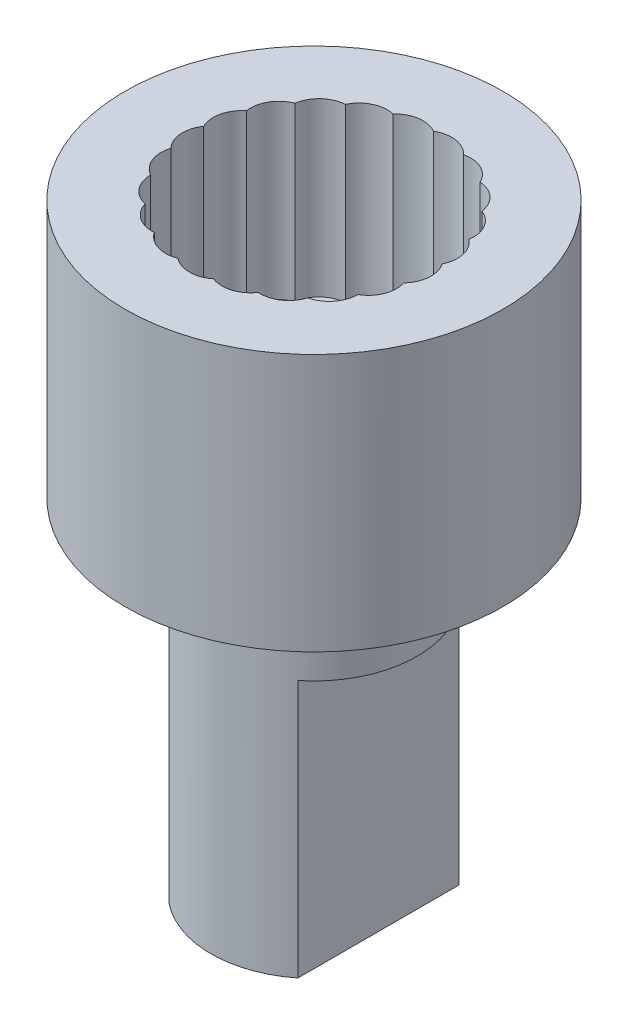
ISO-10303-21;
HEADER;
FILE_DESCRIPTION(('STEP AP214'),'2;1');
FILE_NAME('part.step','',(''),(''),'','','');
FILE_SCHEMA(('AUTOMOTIVE_DESIGN { 1 0 10303 214 1 1 1 1 }'));
ENDSEC;
DATA;
#1=APPLICATION_CONTEXT('core data for automotive mechanical design processes');
#2=APPLICATION_PROTOCOL_DEFINITION('international standard','automotive_design',2000,#1);
#3=PRODUCT_CONTEXT('',#1,'mechanical');
#4=PRODUCT('Part','Part','',(#3));
#5=PRODUCT_RELATED_PRODUCT_CATEGORY('part','',(#4));
#6=PRODUCT_DEFINITION_FORMATION('','',#4);
#7=PRODUCT_DEFINITION_CONTEXT('part definition',#1,'design');
#8=PRODUCT_DEFINITION('design','',#6,#7);
#9=PRODUCT_DEFINITION_SHAPE('','',#8);
#10=(LENGTH_UNIT() NAMED_UNIT(*) SI_UNIT(.MILLI.,.METRE.));
#11=(NAMED_UNIT(*) PLANE_ANGLE_UNIT() SI_UNIT($,.RADIAN.));
#12=(NAMED_UNIT(*) SI_UNIT($,.STERADIAN.) SOLID_ANGLE_UNIT());
#13=UNCERTAINTY_MEASURE_WITH_UNIT(LENGTH_MEASURE(1.E-05),#10,'distance_accuracy_value','');
#14=(GEOMETRIC_REPRESENTATION_CONTEXT(3) GLOBAL_UNCERTAINTY_ASSIGNED_CONTEXT((#13)) GLOBAL_UNIT_ASSIGNED_CONTEXT((#10,
#11,#12)) REPRESENTATION_CONTEXT('',''));
#15=CARTESIAN_POINT('',(0.,0.,0.));
#16=DIRECTION('',(0.,0.,1.));
#17=DIRECTION('',(1.,0.,0.));
#18=AXIS2_PLACEMENT_3D('',#15,#16,#17);
#19=CARTESIAN_POINT('',(0.,-4.,0.));
#20=DIRECTION('',(0.,-1.,0.));
#21=DIRECTION('',(0.,0.,-1.));
#22=AXIS2_PLACEMENT_3D('',#19,#20,#21);
#23=PLANE('',#22);
#24=CARTESIAN_POINT('',(0.,-4.,0.));
#25=DIRECTION('',(0.,-1.,0.));
#26=DIRECTION('',(0.,0.,-1.));
#27=AXIS2_PLACEMENT_3D('',#24,#25,#26);
#28=CIRCLE('',#27,2.4);
#29=CARTESIAN_POINT('',(1.5,-4.,-1.87349939951952));
#30=VERTEX_POINT('',#29);
#31=CARTESIAN_POINT('',(1.5,-4.,1.87349939951952));
#32=VERTEX_POINT('',#31);
#33=EDGE_CURVE('E465',#30,#32,#28,.T.);
#34=ORIENTED_EDGE('',*,*,#33,.T.);
#35=DIRECTION('',(0.,0.,-1.));
#36=VECTOR('',#35,1.);
#37=CARTESIAN_POINT('',(1.5,-4.,0.));
#38=LINE('',#37,#36);
#39=EDGE_CURVE('E430',#32,#30,#38,.T.);
#40=ORIENTED_EDGE('',*,*,#39,.T.);
#41=EDGE_LOOP('',(#34,#40));
#42=FACE_BOUND('',#41,.T.);
#43=ADVANCED_FACE('F41',(#42),#23,.T.);
#44=CARTESIAN_POINT('',(0.,-2.,0.));
#45=DIRECTION('',(0.,1.,0.));
#46=DIRECTION('',(0.,0.,1.));
#47=AXIS2_PLACEMENT_3D('',#44,#45,#46);
#48=CYLINDRICAL_SURFACE('',#47,4.4);
#49=CARTESIAN_POINT('',(0.,-2.,0.));
#50=DIRECTION('',(0.,-1.,0.));
#51=DIRECTION('',(0.,0.,-1.));
#52=AXIS2_PLACEMENT_3D('',#49,#50,#51);
#53=CIRCLE('',#52,4.4);
#54=CARTESIAN_POINT('',(0.,-2.,-4.4));
#55=VERTEX_POINT('',#54);
#56=EDGE_CURVE('E45',#55,#55,#53,.T.);
#57=ORIENTED_EDGE('',*,*,#56,.F.);
#58=EDGE_LOOP('',(#57));
#59=FACE_BOUND('',#58,.T.);
#60=CARTESIAN_POINT('',(0.,4.,0.));
#61=DIRECTION('',(0.,1.,0.));
#62=DIRECTION('',(0.,0.,1.));
#63=AXIS2_PLACEMENT_3D('',#60,#61,#62);
#64=CIRCLE('',#63,4.4);
#65=CARTESIAN_POINT('',(0.,4.,4.4));
#66=VERTEX_POINT('',#65);
#67=EDGE_CURVE('E370',#66,#66,#64,.T.);
#68=ORIENTED_EDGE('',*,*,#67,.F.);
#69=EDGE_LOOP('',(#68));
#70=FACE_BOUND('',#69,.T.);
#71=ADVANCED_FACE('F494',(#59,#70),#48,.T.);
#72=CARTESIAN_POINT('',(0.,-2.,0.));
#73=DIRECTION('',(0.,-1.,0.));
#74=DIRECTION('',(0.,0.,-1.));
#75=AXIS2_PLACEMENT_3D('',#72,#73,#74);
#76=PLANE('',#75);
#77=CARTESIAN_POINT('',(0.,-2.,0.));
#78=DIRECTION('',(0.,-1.,0.));
#79=DIRECTION('',(0.,0.,-1.));
#80=AXIS2_PLACEMENT_3D('',#77,#78,#79);
#81=CIRCLE('',#80,2.4);
#82=CARTESIAN_POINT('',(0.,-2.,-2.4));
#83=VERTEX_POINT('',#82);
#84=EDGE_CURVE('E11',#83,#83,#81,.T.);
#85=ORIENTED_EDGE('',*,*,#84,.F.);
#86=EDGE_LOOP('',(#85));
#87=FACE_BOUND('',#86,.T.);
#88=ORIENTED_EDGE('',*,*,#56,.T.);
#89=EDGE_LOOP('',(#88));
#90=FACE_BOUND('',#89,.T.);
#91=ADVANCED_FACE('F499',(#87,#90),#76,.T.);
#92=CARTESIAN_POINT('',(0.,-4.,0.));
#93=DIRECTION('',(0.,1.,0.));
#94=DIRECTION('',(0.,0.,1.));
#95=AXIS2_PLACEMENT_3D('',#92,#93,#94);
#96=CYLINDRICAL_SURFACE('',#95,2.4);
#97=ORIENTED_EDGE('',*,*,#33,.F.);
#98=DIRECTION('',(0.,1.,0.));
#99=VECTOR('',#98,1.);
#100=CARTESIAN_POINT('',(1.5,-10.,-1.87349939951952));
#101=LINE('',#100,#99);
#102=CARTESIAN_POINT('',(1.5,-10.,-1.87349939951952));
#103=VERTEX_POINT('',#102);
#104=EDGE_CURVE('E448',#103,#30,#101,.T.);
#105=ORIENTED_EDGE('',*,*,#104,.F.);
#106=CARTESIAN_POINT('',(0.,-10.,0.));
#107=DIRECTION('',(0.,-1.,0.));
#108=DIRECTION('',(0.,0.,-1.));
#109=AXIS2_PLACEMENT_3D('',#106,#107,#108);
#110=CIRCLE('',#109,2.4);
#111=CARTESIAN_POINT('',(-1.5,-10.,-1.87349939951952));
#112=VERTEX_POINT('',#111);
#113=EDGE_CURVE('E440',#112,#103,#110,.T.);
#114=ORIENTED_EDGE('',*,*,#113,.F.);
#115=DIRECTION('',(0.,1.,0.));
#116=VECTOR('',#115,1.);
#117=CARTESIAN_POINT('',(-1.5,-10.,-1.87349939951952));
#118=LINE('',#117,#116);
#119=CARTESIAN_POINT('',(-1.5,-4.,-1.87349939951952));
#120=VERTEX_POINT('',#119);
#121=EDGE_CURVE('E452',#112,#120,#118,.T.);
#122=ORIENTED_EDGE('',*,*,#121,.T.);
#123=CARTESIAN_POINT('',(-1.5,-4.,1.87349939951952));
#124=VERTEX_POINT('',#123);
#125=EDGE_CURVE('E464',#124,#120,#28,.T.);
#126=ORIENTED_EDGE('',*,*,#125,.F.);
#127=DIRECTION('',(0.,1.,0.));
#128=VECTOR('',#127,1.);
#129=CARTESIAN_POINT('',(-1.5,-10.,1.87349939951952));
#130=LINE('',#129,#128);
#131=CARTESIAN_POINT('',(-1.5,-10.,1.87349939951952));
#132=VERTEX_POINT('',#131);
#133=EDGE_CURVE('E456',#132,#124,#130,.T.);
#134=ORIENTED_EDGE('',*,*,#133,.F.);
#135=CARTESIAN_POINT('',(1.5,-10.,1.87349939951952));
#136=VERTEX_POINT('',#135);
#137=EDGE_CURVE('E435',#136,#132,#110,.T.);
#138=ORIENTED_EDGE('',*,*,#137,.F.);
#139=DIRECTION('',(0.,1.,0.));
#140=VECTOR('',#139,1.);
#141=CARTESIAN_POINT('',(1.5,-10.,1.87349939951952));
#142=LINE('',#141,#140);
#143=EDGE_CURVE('E460',#136,#32,#142,.T.);
#144=ORIENTED_EDGE('',*,*,#143,.T.);
#145=EDGE_LOOP('',(#97,#105,#114,#122,#126,#134,#138,#144));
#146=FACE_BOUND('',#145,.T.);
#147=ORIENTED_EDGE('',*,*,#84,.T.);
#148=EDGE_LOOP('',(#147));
#149=FACE_BOUND('',#148,.T.);
#150=ADVANCED_FACE('F482',(#146,#149),#96,.T.);
#151=DIRECTION('',(0.,0.,-1.));
#152=VECTOR('',#151,1.);
#153=CARTESIAN_POINT('',(-1.5,-4.,0.));
#154=LINE('',#153,#152);
#155=EDGE_CURVE('E436',#124,#120,#154,.T.);
#156=ORIENTED_EDGE('',*,*,#155,.F.);
#157=ORIENTED_EDGE('',*,*,#125,.T.);
#158=EDGE_LOOP('',(#156,#157));
#159=FACE_BOUND('',#158,.T.);
#160=ADVANCED_FACE('F474',(#159),#23,.T.);
#161=CARTESIAN_POINT('',(1.5,-10.,0.));
#162=DIRECTION('',(1.,0.,0.));
#163=DIRECTION('',(0.,0.,-1.));
#164=AXIS2_PLACEMENT_3D('',#161,#162,#163);
#165=PLANE('',#164);
#166=ORIENTED_EDGE('',*,*,#39,.F.);
#167=ORIENTED_EDGE('',*,*,#143,.F.);
#168=DIRECTION('',(0.,0.,-1.));
#169=VECTOR('',#168,1.);
#170=CARTESIAN_POINT('',(1.5,-10.,0.));
#171=LINE('',#170,#169);
#172=EDGE_CURVE('E431',#136,#103,#171,.T.);
#173=ORIENTED_EDGE('',*,*,#172,.T.);
#174=ORIENTED_EDGE('',*,*,#104,.T.);
#175=EDGE_LOOP('',(#166,#167,#173,#174));
#176=FACE_BOUND('',#175,.T.);
#177=ADVANCED_FACE('F492',(#176),#165,.T.);
#178=CARTESIAN_POINT('',(-1.5,-10.,0.));
#179=DIRECTION('',(1.,0.,0.));
#180=DIRECTION('',(0.,0.,-1.));
#181=AXIS2_PLACEMENT_3D('',#178,#179,#180);
#182=PLANE('',#181);
#183=ORIENTED_EDGE('',*,*,#155,.T.);
#184=ORIENTED_EDGE('',*,*,#121,.F.);
#185=DIRECTION('',(0.,0.,-1.));
#186=VECTOR('',#185,1.);
#187=CARTESIAN_POINT('',(-1.5,-10.,0.));
#188=LINE('',#187,#186);
#189=EDGE_CURVE('E439',#132,#112,#188,.T.);
#190=ORIENTED_EDGE('',*,*,#189,.F.);
#191=ORIENTED_EDGE('',*,*,#133,.T.);
#192=EDGE_LOOP('',(#183,#184,#190,#191));
#193=FACE_BOUND('',#192,.T.);
#194=ADVANCED_FACE('F479',(#193),#182,.F.);
#195=CARTESIAN_POINT('',(0.,-10.,0.));
#196=DIRECTION('',(0.,-1.,0.));
#197=DIRECTION('',(0.,0.,-1.));
#198=AXIS2_PLACEMENT_3D('',#195,#196,#197);
#199=PLANE('',#198);
#200=ORIENTED_EDGE('',*,*,#172,.F.);
#201=ORIENTED_EDGE('',*,*,#137,.T.);
#202=ORIENTED_EDGE('',*,*,#189,.T.);
#203=ORIENTED_EDGE('',*,*,#113,.T.);
#204=EDGE_LOOP('',(#200,#201,#202,#203));
#205=FACE_BOUND('',#204,.T.);
#206=ADVANCED_FACE('F488',(#205),#199,.T.);
#207=CARTESIAN_POINT('',(0.,4.,0.));
#208=DIRECTION('',(0.,1.,0.));
#209=DIRECTION('',(0.,0.,1.));
#210=AXIS2_PLACEMENT_3D('',#207,#208,#209);
#211=PLANE('',#210);
#212=ORIENTED_EDGE('',*,*,#67,.T.);
#213=EDGE_LOOP('',(#212));
#214=FACE_BOUND('',#213,.T.);
#215=CARTESIAN_POINT('',(-0.333293227581628,4.,-2.21125608231973));
#216=DIRECTION('',(0.,1.,0.));
#217=DIRECTION('',(0.,0.,1.));
#218=AXIS2_PLACEMENT_3D('',#215,#216,#217);
#219=CIRCLE('',#218,0.663767043184502);
#220=CARTESIAN_POINT('',(0.,4.,-2.78527900178037));
#221=VERTEX_POINT('',#220);
#222=CARTESIAN_POINT('',(-0.820975397952781,4.,-2.66153687062851));
#223=VERTEX_POINT('',#222);
#224=EDGE_CURVE('E220',#221,#223,#219,.T.);
#225=ORIENTED_EDGE('',*,*,#224,.F.);
#226=CARTESIAN_POINT('',(0.33329322758163,4.,-2.21125608231973));
#227=DIRECTION('',(0.,1.,0.));
#228=DIRECTION('',(0.,0.,1.));
#229=AXIS2_PLACEMENT_3D('',#226,#227,#228);
#230=CIRCLE('',#229,0.663767043184509);
#231=CARTESIAN_POINT('',(0.820975397952807,4.,-2.66153687062849));
#232=VERTEX_POINT('',#231);
#233=EDGE_CURVE('E214',#232,#221,#230,.T.);
#234=ORIENTED_EDGE('',*,*,#233,.F.);
#235=CARTESIAN_POINT('',(0.970265116841022,4.,-2.01477627546813));
#236=DIRECTION('',(0.,1.,0.));
#237=DIRECTION('',(0.,0.,1.));
#238=AXIS2_PLACEMENT_3D('',#235,#236,#237);
#239=CIRCLE('',#238,0.663767043184509);
#240=CARTESIAN_POINT('',(1.56900352900631,4.,-2.30130550855909));
#241=VERTEX_POINT('',#240);
#242=EDGE_CURVE('E360',#241,#232,#239,.T.);
#243=ORIENTED_EDGE('',*,*,#242,.F.);
#244=CARTESIAN_POINT('',(1.52102469253075,4.,-1.63927475484114));
#245=DIRECTION('',(0.,1.,0.));
#246=DIRECTION('',(0.,0.,1.));
#247=AXIS2_PLACEMENT_3D('',#244,#245,#246);
#248=CIRCLE('',#247,0.663767043184509);
#249=CARTESIAN_POINT('',(2.17761881104903,4.,-1.73659305294133));
#250=VERTEX_POINT('',#249);
#251=EDGE_CURVE('E356',#250,#241,#248,.T.);
#252=ORIENTED_EDGE('',*,*,#251,.F.);
#253=CARTESIAN_POINT('',(1.93663454938221,4.,-1.11811647840774));
#254=DIRECTION('',(0.,1.,0.));
#255=DIRECTION('',(0.,0.,1.));
#256=AXIS2_PLACEMENT_3D('',#253,#254,#255);
#257=CIRCLE('',#256,0.663767043184509);
#258=CARTESIAN_POINT('',(2.59274310540728,4.,-1.01757668365665));
#259=VERTEX_POINT('',#258);
#260=EDGE_CURVE('E352',#259,#250,#257,.T.);
#261=ORIENTED_EDGE('',*,*,#260,.F.);
#262=CARTESIAN_POINT('',(2.18016592774031,4.,-0.497608646094468));
#263=DIRECTION('',(0.,1.,0.));
#264=DIRECTION('',(0.,0.,1.));
#265=AXIS2_PLACEMENT_3D('',#262,#263,#264);
#266=CIRCLE('',#265,0.663767043184509);
#267=CARTESIAN_POINT('',(2.77749079678439,4.,-0.208144160467343));
#268=VERTEX_POINT('',#267);
#269=EDGE_CURVE('E348',#268,#259,#266,.T.);
#270=ORIENTED_EDGE('',*,*,#269,.F.);
#271=CARTESIAN_POINT('',(2.2299799959181,4.,0.167113898143874));
#272=DIRECTION('',(0.,1.,0.));
#273=DIRECTION('',(0.,0.,1.));
#274=AXIS2_PLACEMENT_3D('',#271,#272,#273);
#275=CIRCLE('',#274,0.663767043184509);
#276=CARTESIAN_POINT('',(2.71544624204961,4.,0.619782884805087));
#277=VERTEX_POINT('',#276);
#278=EDGE_CURVE('E344',#277,#268,#275,.T.);
#279=ORIENTED_EDGE('',*,*,#278,.F.);
#280=CARTESIAN_POINT('',(2.08165055535255,4.,0.816987639164871));
#281=DIRECTION('',(0.,1.,0.));
#282=DIRECTION('',(0.,0.,1.));
#283=AXIS2_PLACEMENT_3D('',#280,#281,#282);
#284=CIRCLE('',#283,0.663767043184509);
#285=CARTESIAN_POINT('',(2.41212237216916,4.,1.39263950089019));
#286=VERTEX_POINT('',#285);
#287=EDGE_CURVE('E340',#286,#277,#284,.T.);
#288=ORIENTED_EDGE('',*,*,#287,.F.);
#289=CARTESIAN_POINT('',(1.74835732777092,4.,1.39426844315487));
#290=DIRECTION('',(0.,1.,0.));
#291=DIRECTION('',(0.,0.,1.));
#292=AXIS2_PLACEMENT_3D('',#289,#290,#291);
#293=CIRCLE('',#292,0.663767043184509);
#294=CARTESIAN_POINT('',(1.8944708440968,4.,2.04175398582342));
#295=VERTEX_POINT('',#294);
#296=EDGE_CURVE('E336',#295,#286,#293,.T.);
#297=ORIENTED_EDGE('',*,*,#296,.F.);
#298=CARTESIAN_POINT('',(1.25971487907708,4.,1.84766237732427));
#299=DIRECTION('',(0.,1.,0.));
#300=DIRECTION('',(0.,0.,1.));
#301=AXIS2_PLACEMENT_3D('',#298,#299,#300);
#302=CIRCLE('',#301,0.663767043184508);
#303=CARTESIAN_POINT('',(1.20848726777808,4.,2.50944966902645));
#304=VERTEX_POINT('',#303);
#305=EDGE_CURVE('E332',#304,#295,#302,.T.);
#306=ORIENTED_EDGE('',*,*,#305,.F.);
#307=CARTESIAN_POINT('',(0.659141235209555,4.,2.13688340093562));
#308=DIRECTION('',(0.,1.,0.));
#309=DIRECTION('',(0.,0.,1.));
#310=AXIS2_PLACEMENT_3D('',#307,#308,#309);
#311=CIRCLE('',#310,0.663767043184509);
#312=CARTESIAN_POINT('',(0.415124294358251,4.,2.75416973659799));
#313=VERTEX_POINT('',#312);
#314=EDGE_CURVE('E328',#313,#304,#311,.T.);
#315=ORIENTED_EDGE('',*,*,#314,.F.);
#316=CARTESIAN_POINT('',(0.,4.,2.2362329568155));
#317=DIRECTION('',(0.,1.,0.));
#318=DIRECTION('',(0.,0.,1.));
#319=AXIS2_PLACEMENT_3D('',#316,#317,#318);
#320=CIRCLE('',#319,0.663767043184509);
#321=CARTESIAN_POINT('',(-0.415124294358269,4.,2.75416973659799));
#322=VERTEX_POINT('',#321);
#323=EDGE_CURVE('E324',#322,#313,#320,.T.);
#324=ORIENTED_EDGE('',*,*,#323,.F.);
#325=CARTESIAN_POINT('',(-0.659141235209571,4.,2.13688340093562));
#326=DIRECTION('',(0.,1.,0.));
#327=DIRECTION('',(0.,0.,1.));
#328=AXIS2_PLACEMENT_3D('',#325,#326,#327);
#329=CIRCLE('',#328,0.663767043184509);
#330=CARTESIAN_POINT('',(-1.2084872677781,4.,2.50944966902644));
#331=VERTEX_POINT('',#330);
#332=EDGE_CURVE('E320',#331,#322,#329,.T.);
#333=ORIENTED_EDGE('',*,*,#332,.F.);
#334=CARTESIAN_POINT('',(-1.2597148790771,4.,1.84766237732427));
#335=DIRECTION('',(0.,1.,0.));
#336=DIRECTION('',(0.,0.,1.));
#337=AXIS2_PLACEMENT_3D('',#334,#335,#336);
#338=CIRCLE('',#337,0.663767043184509);
#339=CARTESIAN_POINT('',(-1.89447084409682,4.,2.04175398582341));
#340=VERTEX_POINT('',#339);
#341=EDGE_CURVE('E316',#340,#331,#338,.T.);
#342=ORIENTED_EDGE('',*,*,#341,.F.);
#343=CARTESIAN_POINT('',(-1.74835732777093,4.,1.39426844315486));
#344=DIRECTION('',(0.,1.,0.));
#345=DIRECTION('',(0.,0.,1.));
#346=AXIS2_PLACEMENT_3D('',#343,#344,#345);
#347=CIRCLE('',#346,0.663767043184509);
#348=CARTESIAN_POINT('',(-2.41212237216917,4.,1.39263950089018));
#349=VERTEX_POINT('',#348);
#350=EDGE_CURVE('E312',#349,#340,#347,.T.);
#351=ORIENTED_EDGE('',*,*,#350,.F.);
#352=CARTESIAN_POINT('',(-2.08165055535256,4.,0.816987639164863));
#353=DIRECTION('',(0.,1.,0.));
#354=DIRECTION('',(0.,0.,1.));
#355=AXIS2_PLACEMENT_3D('',#352,#353,#354);
#356=CIRCLE('',#355,0.663767043184508);
#357=CARTESIAN_POINT('',(-2.71544624204962,4.,0.619782884805078));
#358=VERTEX_POINT('',#357);
#359=EDGE_CURVE('E308',#358,#349,#356,.T.);
#360=ORIENTED_EDGE('',*,*,#359,.F.);
#361=CARTESIAN_POINT('',(-2.22997999591811,4.,0.167113898143865));
#362=DIRECTION('',(0.,1.,0.));
#363=DIRECTION('',(0.,0.,1.));
#364=AXIS2_PLACEMENT_3D('',#361,#362,#363);
#365=CIRCLE('',#364,0.663767043184509);
#366=CARTESIAN_POINT('',(-2.7774907967844,4.,-0.208144160467354));
#367=VERTEX_POINT('',#366);
#368=EDGE_CURVE('E304',#367,#358,#365,.T.);
#369=ORIENTED_EDGE('',*,*,#368,.F.);
#370=CARTESIAN_POINT('',(-2.18016592774032,4.,-0.497608646094477));
#371=DIRECTION('',(0.,1.,0.));
#372=DIRECTION('',(0.,0.,1.));
#373=AXIS2_PLACEMENT_3D('',#370,#371,#372);
#374=CIRCLE('',#373,0.663767043184509);
#375=CARTESIAN_POINT('',(-2.59274310540728,4.,-1.01757668365666));
#376=VERTEX_POINT('',#375);
#377=EDGE_CURVE('E300',#376,#367,#374,.T.);
#378=ORIENTED_EDGE('',*,*,#377,.F.);
#379=CARTESIAN_POINT('',(-1.93663454938219,4.,-1.11811647840777));
#380=DIRECTION('',(0.,1.,0.));
#381=DIRECTION('',(0.,0.,1.));
#382=AXIS2_PLACEMENT_3D('',#379,#380,#381);
#383=CIRCLE('',#382,0.663767043184519);
#384=CARTESIAN_POINT('',(-2.177618811049,4.,-1.73659305294138));
#385=VERTEX_POINT('',#384);
#386=EDGE_CURVE('E296',#385,#376,#383,.T.);
#387=ORIENTED_EDGE('',*,*,#386,.F.);
#388=CARTESIAN_POINT('',(-1.52102469253073,4.,-1.63927475484116));
#389=DIRECTION('',(0.,1.,0.));
#390=DIRECTION('',(0.,0.,1.));
#391=AXIS2_PLACEMENT_3D('',#388,#389,#390);
#392=CIRCLE('',#391,0.663767043184509);
#393=CARTESIAN_POINT('',(-1.56900352900628,4.,-2.30130550855911));
#394=VERTEX_POINT('',#393);
#395=EDGE_CURVE('E292',#394,#385,#392,.T.);
#396=ORIENTED_EDGE('',*,*,#395,.F.);
#397=CARTESIAN_POINT('',(-0.970265116840991,4.,-2.01477627546815));
#398=DIRECTION('',(0.,1.,0.));
#399=DIRECTION('',(0.,0.,1.));
#400=AXIS2_PLACEMENT_3D('',#397,#398,#399);
#401=CIRCLE('',#400,0.663767043184509);
#402=EDGE_CURVE('E289',#223,#394,#401,.T.);
#403=ORIENTED_EDGE('',*,*,#402,.F.);
#404=EDGE_LOOP('',(#225,#234,#243,#252,#261,#270,#279,#288,#297,#306,#315,#324,#333,#342,#351,
#360,#369,#378,#387,#396,#403));
#405=FACE_BOUND('',#404,.T.);
#406=ADVANCED_FACE('F43',(#214,#405),#211,.T.);
#407=CARTESIAN_POINT('',(-0.333293227581628,0.,-2.21125608231973));
#408=DIRECTION('',(0.,1.,0.));
#409=DIRECTION('',(0.,0.,1.));
#410=AXIS2_PLACEMENT_3D('',#407,#408,#409);
#411=CYLINDRICAL_SURFACE('',#410,0.663767043184502);
#412=ORIENTED_EDGE('',*,*,#224,.T.);
#413=DIRECTION('',(0.,1.,0.));
#414=VECTOR('',#413,1.);
#415=CARTESIAN_POINT('',(-0.820975397952781,0.,-2.66153687062851));
#416=LINE('',#415,#414);
#417=CARTESIAN_POINT('',(-0.820975397952781,0.,-2.66153687062851));
#418=VERTEX_POINT('',#417);
#419=EDGE_CURVE('E217',#418,#223,#416,.T.);
#420=ORIENTED_EDGE('',*,*,#419,.F.);
#421=CARTESIAN_POINT('',(-0.333293227581628,0.,-2.21125608231973));
#422=DIRECTION('',(0.,1.,0.));
#423=DIRECTION('',(0.,0.,1.));
#424=AXIS2_PLACEMENT_3D('',#421,#422,#423);
#425=CIRCLE('',#424,0.663767043184502);
#426=CARTESIAN_POINT('',(0.,0.,-2.78527900178037));
#427=VERTEX_POINT('',#426);
#428=EDGE_CURVE('E206',#427,#418,#425,.T.);
#429=ORIENTED_EDGE('',*,*,#428,.F.);
#430=DIRECTION('',(0.,1.,0.));
#431=VECTOR('',#430,1.);
#432=CARTESIAN_POINT('',(0.,0.,-2.78527900178037));
#433=LINE('',#432,#431);
#434=EDGE_CURVE('E367',#427,#221,#433,.T.);
#435=ORIENTED_EDGE('',*,*,#434,.T.);
#436=EDGE_LOOP('',(#412,#420,#429,#435));
#437=FACE_BOUND('',#436,.T.);
#438=ADVANCED_FACE('F218',(#437),#411,.F.);
#439=CARTESIAN_POINT('',(0.33329322758163,0.,-2.21125608231973));
#440=DIRECTION('',(0.,1.,0.));
#441=DIRECTION('',(0.,0.,1.));
#442=AXIS2_PLACEMENT_3D('',#439,#440,#441);
#443=CYLINDRICAL_SURFACE('',#442,0.663767043184509);
#444=ORIENTED_EDGE('',*,*,#233,.T.);
#445=ORIENTED_EDGE('',*,*,#434,.F.);
#446=CARTESIAN_POINT('',(0.33329322758163,0.,-2.21125608231973));
#447=DIRECTION('',(0.,1.,0.));
#448=DIRECTION('',(0.,0.,1.));
#449=AXIS2_PLACEMENT_3D('',#446,#447,#448);
#450=CIRCLE('',#449,0.663767043184509);
#451=CARTESIAN_POINT('',(0.820975397952807,0.,-2.66153687062849));
#452=VERTEX_POINT('',#451);
#453=EDGE_CURVE('E57',#452,#427,#450,.T.);
#454=ORIENTED_EDGE('',*,*,#453,.F.);
#455=DIRECTION('',(0.,1.,0.));
#456=VECTOR('',#455,1.);
#457=CARTESIAN_POINT('',(0.820975397952807,0.,-2.66153687062849));
#458=LINE('',#457,#456);
#459=EDGE_CURVE('E371',#452,#232,#458,.T.);
#460=ORIENTED_EDGE('',*,*,#459,.T.);
#461=EDGE_LOOP('',(#444,#445,#454,#460));
#462=FACE_BOUND('',#461,.T.);
#463=ADVANCED_FACE('F530',(#462),#443,.F.);
#464=CARTESIAN_POINT('',(0.970265116841022,0.,-2.01477627546813));
#465=DIRECTION('',(0.,1.,0.));
#466=DIRECTION('',(0.,0.,1.));
#467=AXIS2_PLACEMENT_3D('',#464,#465,#466);
#468=CYLINDRICAL_SURFACE('',#467,0.663767043184509);
#469=ORIENTED_EDGE('',*,*,#242,.T.);
#470=ORIENTED_EDGE('',*,*,#459,.F.);
#471=CARTESIAN_POINT('',(0.970265116841022,0.,-2.01477627546813));
#472=DIRECTION('',(0.,1.,0.));
#473=DIRECTION('',(0.,0.,1.));
#474=AXIS2_PLACEMENT_3D('',#471,#472,#473);
#475=CIRCLE('',#474,0.663767043184509);
#476=CARTESIAN_POINT('',(1.56900352900631,0.,-2.30130550855909));
#477=VERTEX_POINT('',#476);
#478=EDGE_CURVE('E62',#477,#452,#475,.T.);
#479=ORIENTED_EDGE('',*,*,#478,.F.);
#480=DIRECTION('',(0.,1.,0.));
#481=VECTOR('',#480,1.);
#482=CARTESIAN_POINT('',(1.56900352900631,0.,-2.30130550855909));
#483=LINE('',#482,#481);
#484=EDGE_CURVE('E374',#477,#241,#483,.T.);
#485=ORIENTED_EDGE('',*,*,#484,.T.);
#486=EDGE_LOOP('',(#469,#470,#479,#485));
#487=FACE_BOUND('',#486,.T.);
#488=ADVANCED_FACE('F566',(#487),#468,.F.);
#489=CARTESIAN_POINT('',(1.52102469253075,0.,-1.63927475484114));
#490=DIRECTION('',(0.,1.,0.));
#491=DIRECTION('',(0.,0.,1.));
#492=AXIS2_PLACEMENT_3D('',#489,#490,#491);
#493=CYLINDRICAL_SURFACE('',#492,0.663767043184509);
#494=ORIENTED_EDGE('',*,*,#251,.T.);
#495=ORIENTED_EDGE('',*,*,#484,.F.);
#496=CARTESIAN_POINT('',(1.52102469253075,0.,-1.63927475484114));
#497=DIRECTION('',(0.,1.,0.));
#498=DIRECTION('',(0.,0.,1.));
#499=AXIS2_PLACEMENT_3D('',#496,#497,#498);
#500=CIRCLE('',#499,0.663767043184509);
#501=CARTESIAN_POINT('',(2.17761881104903,0.,-1.73659305294133));
#502=VERTEX_POINT('',#501);
#503=EDGE_CURVE('E280',#502,#477,#500,.T.);
#504=ORIENTED_EDGE('',*,*,#503,.F.);
#505=DIRECTION('',(0.,1.,0.));
#506=VECTOR('',#505,1.);
#507=CARTESIAN_POINT('',(2.17761881104903,0.,-1.73659305294133));
#508=LINE('',#507,#506);
#509=EDGE_CURVE('E377',#502,#250,#508,.T.);
#510=ORIENTED_EDGE('',*,*,#509,.T.);
#511=EDGE_LOOP('',(#494,#495,#504,#510));
#512=FACE_BOUND('',#511,.T.);
#513=ADVANCED_FACE('F574',(#512),#493,.F.);
#514=CARTESIAN_POINT('',(1.93663454938221,0.,-1.11811647840774));
#515=DIRECTION('',(0.,1.,0.));
#516=DIRECTION('',(0.,0.,1.));
#517=AXIS2_PLACEMENT_3D('',#514,#515,#516);
#518=CYLINDRICAL_SURFACE('',#517,0.663767043184509);
#519=ORIENTED_EDGE('',*,*,#260,.T.);
#520=ORIENTED_EDGE('',*,*,#509,.F.);
#521=CARTESIAN_POINT('',(1.93663454938221,0.,-1.11811647840774));
#522=DIRECTION('',(0.,1.,0.));
#523=DIRECTION('',(0.,0.,1.));
#524=AXIS2_PLACEMENT_3D('',#521,#522,#523);
#525=CIRCLE('',#524,0.663767043184509);
#526=CARTESIAN_POINT('',(2.59274310540728,0.,-1.01757668365665));
#527=VERTEX_POINT('',#526);
#528=EDGE_CURVE('E277',#527,#502,#525,.T.);
#529=ORIENTED_EDGE('',*,*,#528,.F.);
#530=DIRECTION('',(0.,1.,0.));
#531=VECTOR('',#530,1.);
#532=CARTESIAN_POINT('',(2.59274310540728,0.,-1.01757668365665));
#533=LINE('',#532,#531);
#534=EDGE_CURVE('E380',#527,#259,#533,.T.);
#535=ORIENTED_EDGE('',*,*,#534,.T.);
#536=EDGE_LOOP('',(#519,#520,#529,#535));
#537=FACE_BOUND('',#536,.T.);
#538=ADVANCED_FACE('F582',(#537),#518,.F.);
#539=CARTESIAN_POINT('',(2.18016592774031,0.,-0.497608646094468));
#540=DIRECTION('',(0.,1.,0.));
#541=DIRECTION('',(0.,0.,1.));
#542=AXIS2_PLACEMENT_3D('',#539,#540,#541);
#543=CYLINDRICAL_SURFACE('',#542,0.663767043184509);
#544=ORIENTED_EDGE('',*,*,#269,.T.);
#545=ORIENTED_EDGE('',*,*,#534,.F.);
#546=CARTESIAN_POINT('',(2.18016592774031,0.,-0.497608646094468));
#547=DIRECTION('',(0.,1.,0.));
#548=DIRECTION('',(0.,0.,1.));
#549=AXIS2_PLACEMENT_3D('',#546,#547,#548);
#550=CIRCLE('',#549,0.663767043184509);
#551=CARTESIAN_POINT('',(2.77749079678439,0.,-0.208144160467343));
#552=VERTEX_POINT('',#551);
#553=EDGE_CURVE('E274',#552,#527,#550,.T.);
#554=ORIENTED_EDGE('',*,*,#553,.F.);
#555=DIRECTION('',(0.,1.,0.));
#556=VECTOR('',#555,1.);
#557=CARTESIAN_POINT('',(2.77749079678439,0.,-0.208144160467343));
#558=LINE('',#557,#556);
#559=EDGE_CURVE('E383',#552,#268,#558,.T.);
#560=ORIENTED_EDGE('',*,*,#559,.T.);
#561=EDGE_LOOP('',(#544,#545,#554,#560));
#562=FACE_BOUND('',#561,.T.);
#563=ADVANCED_FACE('F590',(#562),#543,.F.);
#564=CARTESIAN_POINT('',(2.2299799959181,0.,0.167113898143874));
#565=DIRECTION('',(0.,1.,0.));
#566=DIRECTION('',(0.,0.,1.));
#567=AXIS2_PLACEMENT_3D('',#564,#565,#566);
#568=CYLINDRICAL_SURFACE('',#567,0.663767043184509);
#569=ORIENTED_EDGE('',*,*,#278,.T.);
#570=ORIENTED_EDGE('',*,*,#559,.F.);
#571=CARTESIAN_POINT('',(2.2299799959181,0.,0.167113898143874));
#572=DIRECTION('',(0.,1.,0.));
#573=DIRECTION('',(0.,0.,1.));
#574=AXIS2_PLACEMENT_3D('',#571,#572,#573);
#575=CIRCLE('',#574,0.663767043184509);
#576=CARTESIAN_POINT('',(2.71544624204961,0.,0.619782884805087));
#577=VERTEX_POINT('',#576);
#578=EDGE_CURVE('E271',#577,#552,#575,.T.);
#579=ORIENTED_EDGE('',*,*,#578,.F.);
#580=DIRECTION('',(0.,1.,0.));
#581=VECTOR('',#580,1.);
#582=CARTESIAN_POINT('',(2.71544624204961,0.,0.619782884805087));
#583=LINE('',#582,#581);
#584=EDGE_CURVE('E386',#577,#277,#583,.T.);
#585=ORIENTED_EDGE('',*,*,#584,.T.);
#586=EDGE_LOOP('',(#569,#570,#579,#585));
#587=FACE_BOUND('',#586,.T.);
#588=ADVANCED_FACE('F598',(#587),#568,.F.);
#589=CARTESIAN_POINT('',(2.08165055535255,0.,0.816987639164871));
#590=DIRECTION('',(0.,1.,0.));
#591=DIRECTION('',(0.,0.,1.));
#592=AXIS2_PLACEMENT_3D('',#589,#590,#591);
#593=CYLINDRICAL_SURFACE('',#592,0.663767043184509);
#594=ORIENTED_EDGE('',*,*,#287,.T.);
#595=ORIENTED_EDGE('',*,*,#584,.F.);
#596=CARTESIAN_POINT('',(2.08165055535255,0.,0.816987639164871));
#597=DIRECTION('',(0.,1.,0.));
#598=DIRECTION('',(0.,0.,1.));
#599=AXIS2_PLACEMENT_3D('',#596,#597,#598);
#600=CIRCLE('',#599,0.663767043184509);
#601=CARTESIAN_POINT('',(2.41212237216916,0.,1.39263950089019));
#602=VERTEX_POINT('',#601);
#603=EDGE_CURVE('E268',#602,#577,#600,.T.);
#604=ORIENTED_EDGE('',*,*,#603,.F.);
#605=DIRECTION('',(0.,1.,0.));
#606=VECTOR('',#605,1.);
#607=CARTESIAN_POINT('',(2.41212237216916,0.,1.39263950089019));
#608=LINE('',#607,#606);
#609=EDGE_CURVE('E389',#602,#286,#608,.T.);
#610=ORIENTED_EDGE('',*,*,#609,.T.);
#611=EDGE_LOOP('',(#594,#595,#604,#610));
#612=FACE_BOUND('',#611,.T.);
#613=ADVANCED_FACE('F606',(#612),#593,.F.);
#614=CARTESIAN_POINT('',(1.74835732777092,0.,1.39426844315487));
#615=DIRECTION('',(0.,1.,0.));
#616=DIRECTION('',(0.,0.,1.));
#617=AXIS2_PLACEMENT_3D('',#614,#615,#616);
#618=CYLINDRICAL_SURFACE('',#617,0.663767043184509);
#619=ORIENTED_EDGE('',*,*,#296,.T.);
#620=ORIENTED_EDGE('',*,*,#609,.F.);
#621=CARTESIAN_POINT('',(1.74835732777092,0.,1.39426844315487));
#622=DIRECTION('',(0.,1.,0.));
#623=DIRECTION('',(0.,0.,1.));
#624=AXIS2_PLACEMENT_3D('',#621,#622,#623);
#625=CIRCLE('',#624,0.663767043184509);
#626=CARTESIAN_POINT('',(1.8944708440968,0.,2.04175398582342));
#627=VERTEX_POINT('',#626);
#628=EDGE_CURVE('E265',#627,#602,#625,.T.);
#629=ORIENTED_EDGE('',*,*,#628,.F.);
#630=DIRECTION('',(0.,1.,0.));
#631=VECTOR('',#630,1.);
#632=CARTESIAN_POINT('',(1.8944708440968,0.,2.04175398582342));
#633=LINE('',#632,#631);
#634=EDGE_CURVE('E392',#627,#295,#633,.T.);
#635=ORIENTED_EDGE('',*,*,#634,.T.);
#636=EDGE_LOOP('',(#619,#620,#629,#635));
#637=FACE_BOUND('',#636,.T.);
#638=ADVANCED_FACE('F614',(#637),#618,.F.);
#639=CARTESIAN_POINT('',(1.25971487907708,0.,1.84766237732427));
#640=DIRECTION('',(0.,1.,0.));
#641=DIRECTION('',(0.,0.,1.));
#642=AXIS2_PLACEMENT_3D('',#639,#640,#641);
#643=CYLINDRICAL_SURFACE('',#642,0.663767043184508);
#644=ORIENTED_EDGE('',*,*,#305,.T.);
#645=ORIENTED_EDGE('',*,*,#634,.F.);
#646=CARTESIAN_POINT('',(1.25971487907708,0.,1.84766237732427));
#647=DIRECTION('',(0.,1.,0.));
#648=DIRECTION('',(0.,0.,1.));
#649=AXIS2_PLACEMENT_3D('',#646,#647,#648);
#650=CIRCLE('',#649,0.663767043184508);
#651=CARTESIAN_POINT('',(1.20848726777808,0.,2.50944966902645));
#652=VERTEX_POINT('',#651);
#653=EDGE_CURVE('E262',#652,#627,#650,.T.);
#654=ORIENTED_EDGE('',*,*,#653,.F.);
#655=DIRECTION('',(0.,1.,0.));
#656=VECTOR('',#655,1.);
#657=CARTESIAN_POINT('',(1.20848726777808,0.,2.50944966902645));
#658=LINE('',#657,#656);
#659=EDGE_CURVE('E395',#652,#304,#658,.T.);
#660=ORIENTED_EDGE('',*,*,#659,.T.);
#661=EDGE_LOOP('',(#644,#645,#654,#660));
#662=FACE_BOUND('',#661,.T.);
#663=ADVANCED_FACE('F622',(#662),#643,.F.);
#664=CARTESIAN_POINT('',(0.659141235209555,0.,2.13688340093562));
#665=DIRECTION('',(0.,1.,0.));
#666=DIRECTION('',(0.,0.,1.));
#667=AXIS2_PLACEMENT_3D('',#664,#665,#666);
#668=CYLINDRICAL_SURFACE('',#667,0.663767043184509);
#669=ORIENTED_EDGE('',*,*,#314,.T.);
#670=ORIENTED_EDGE('',*,*,#659,.F.);
#671=CARTESIAN_POINT('',(0.659141235209555,0.,2.13688340093562));
#672=DIRECTION('',(0.,1.,0.));
#673=DIRECTION('',(0.,0.,1.));
#674=AXIS2_PLACEMENT_3D('',#671,#672,#673);
#675=CIRCLE('',#674,0.663767043184509);
#676=CARTESIAN_POINT('',(0.415124294358251,0.,2.75416973659799));
#677=VERTEX_POINT('',#676);
#678=EDGE_CURVE('E259',#677,#652,#675,.T.);
#679=ORIENTED_EDGE('',*,*,#678,.F.);
#680=DIRECTION('',(0.,1.,0.));
#681=VECTOR('',#680,1.);
#682=CARTESIAN_POINT('',(0.415124294358251,0.,2.75416973659799));
#683=LINE('',#682,#681);
#684=EDGE_CURVE('E398',#677,#313,#683,.T.);
#685=ORIENTED_EDGE('',*,*,#684,.T.);
#686=EDGE_LOOP('',(#669,#670,#679,#685));
#687=FACE_BOUND('',#686,.T.);
#688=ADVANCED_FACE('F630',(#687),#668,.F.);
#689=CARTESIAN_POINT('',(0.,0.,2.2362329568155));
#690=DIRECTION('',(0.,1.,0.));
#691=DIRECTION('',(0.,0.,1.));
#692=AXIS2_PLACEMENT_3D('',#689,#690,#691);
#693=CYLINDRICAL_SURFACE('',#692,0.663767043184509);
#694=ORIENTED_EDGE('',*,*,#323,.T.);
#695=ORIENTED_EDGE('',*,*,#684,.F.);
#696=CARTESIAN_POINT('',(0.,0.,2.2362329568155));
#697=DIRECTION('',(0.,1.,0.));
#698=DIRECTION('',(0.,0.,1.));
#699=AXIS2_PLACEMENT_3D('',#696,#697,#698);
#700=CIRCLE('',#699,0.663767043184509);
#701=CARTESIAN_POINT('',(-0.415124294358269,0.,2.75416973659799));
#702=VERTEX_POINT('',#701);
#703=EDGE_CURVE('E256',#702,#677,#700,.T.);
#704=ORIENTED_EDGE('',*,*,#703,.F.);
#705=DIRECTION('',(0.,1.,0.));
#706=VECTOR('',#705,1.);
#707=CARTESIAN_POINT('',(-0.415124294358269,0.,2.75416973659799));
#708=LINE('',#707,#706);
#709=EDGE_CURVE('E401',#702,#322,#708,.T.);
#710=ORIENTED_EDGE('',*,*,#709,.T.);
#711=EDGE_LOOP('',(#694,#695,#704,#710));
#712=FACE_BOUND('',#711,.T.);
#713=ADVANCED_FACE('F638',(#712),#693,.F.);
#714=CARTESIAN_POINT('',(-0.659141235209571,0.,2.13688340093562));
#715=DIRECTION('',(0.,1.,0.));
#716=DIRECTION('',(0.,0.,1.));
#717=AXIS2_PLACEMENT_3D('',#714,#715,#716);
#718=CYLINDRICAL_SURFACE('',#717,0.663767043184509);
#719=ORIENTED_EDGE('',*,*,#332,.T.);
#720=ORIENTED_EDGE('',*,*,#709,.F.);
#721=CARTESIAN_POINT('',(-0.659141235209571,0.,2.13688340093562));
#722=DIRECTION('',(0.,1.,0.));
#723=DIRECTION('',(0.,0.,1.));
#724=AXIS2_PLACEMENT_3D('',#721,#722,#723);
#725=CIRCLE('',#724,0.663767043184509);
#726=CARTESIAN_POINT('',(-1.2084872677781,0.,2.50944966902644));
#727=VERTEX_POINT('',#726);
#728=EDGE_CURVE('E253',#727,#702,#725,.T.);
#729=ORIENTED_EDGE('',*,*,#728,.F.);
#730=DIRECTION('',(0.,1.,0.));
#731=VECTOR('',#730,1.);
#732=CARTESIAN_POINT('',(-1.2084872677781,0.,2.50944966902644));
#733=LINE('',#732,#731);
#734=EDGE_CURVE('E404',#727,#331,#733,.T.);
#735=ORIENTED_EDGE('',*,*,#734,.T.);
#736=EDGE_LOOP('',(#719,#720,#729,#735));
#737=FACE_BOUND('',#736,.T.);
#738=ADVANCED_FACE('F646',(#737),#718,.F.);
#739=CARTESIAN_POINT('',(-1.2597148790771,0.,1.84766237732427));
#740=DIRECTION('',(0.,1.,0.));
#741=DIRECTION('',(0.,0.,1.));
#742=AXIS2_PLACEMENT_3D('',#739,#740,#741);
#743=CYLINDRICAL_SURFACE('',#742,0.663767043184509);
#744=ORIENTED_EDGE('',*,*,#341,.T.);
#745=ORIENTED_EDGE('',*,*,#734,.F.);
#746=CARTESIAN_POINT('',(-1.2597148790771,0.,1.84766237732427));
#747=DIRECTION('',(0.,1.,0.));
#748=DIRECTION('',(0.,0.,1.));
#749=AXIS2_PLACEMENT_3D('',#746,#747,#748);
#750=CIRCLE('',#749,0.663767043184509);
#751=CARTESIAN_POINT('',(-1.89447084409682,0.,2.04175398582341));
#752=VERTEX_POINT('',#751);
#753=EDGE_CURVE('E250',#752,#727,#750,.T.);
#754=ORIENTED_EDGE('',*,*,#753,.F.);
#755=DIRECTION('',(0.,1.,0.));
#756=VECTOR('',#755,1.);
#757=CARTESIAN_POINT('',(-1.89447084409682,0.,2.04175398582341));
#758=LINE('',#757,#756);
#759=EDGE_CURVE('E407',#752,#340,#758,.T.);
#760=ORIENTED_EDGE('',*,*,#759,.T.);
#761=EDGE_LOOP('',(#744,#745,#754,#760));
#762=FACE_BOUND('',#761,.T.);
#763=ADVANCED_FACE('F654',(#762),#743,.F.);
#764=CARTESIAN_POINT('',(-1.74835732777093,0.,1.39426844315486));
#765=DIRECTION('',(0.,1.,0.));
#766=DIRECTION('',(0.,0.,1.));
#767=AXIS2_PLACEMENT_3D('',#764,#765,#766);
#768=CYLINDRICAL_SURFACE('',#767,0.663767043184509);
#769=ORIENTED_EDGE('',*,*,#350,.T.);
#770=ORIENTED_EDGE('',*,*,#759,.F.);
#771=CARTESIAN_POINT('',(-1.74835732777093,0.,1.39426844315486));
#772=DIRECTION('',(0.,1.,0.));
#773=DIRECTION('',(0.,0.,1.));
#774=AXIS2_PLACEMENT_3D('',#771,#772,#773);
#775=CIRCLE('',#774,0.663767043184509);
#776=CARTESIAN_POINT('',(-2.41212237216917,0.,1.39263950089018));
#777=VERTEX_POINT('',#776);
#778=EDGE_CURVE('E247',#777,#752,#775,.T.);
#779=ORIENTED_EDGE('',*,*,#778,.F.);
#780=DIRECTION('',(0.,1.,0.));
#781=VECTOR('',#780,1.);
#782=CARTESIAN_POINT('',(-2.41212237216917,0.,1.39263950089018));
#783=LINE('',#782,#781);
#784=EDGE_CURVE('E410',#777,#349,#783,.T.);
#785=ORIENTED_EDGE('',*,*,#784,.T.);
#786=EDGE_LOOP('',(#769,#770,#779,#785));
#787=FACE_BOUND('',#786,.T.);
#788=ADVANCED_FACE('F662',(#787),#768,.F.);
#789=CARTESIAN_POINT('',(-2.08165055535256,0.,0.816987639164863));
#790=DIRECTION('',(0.,1.,0.));
#791=DIRECTION('',(0.,0.,1.));
#792=AXIS2_PLACEMENT_3D('',#789,#790,#791);
#793=CYLINDRICAL_SURFACE('',#792,0.663767043184508);
#794=ORIENTED_EDGE('',*,*,#359,.T.);
#795=ORIENTED_EDGE('',*,*,#784,.F.);
#796=CARTESIAN_POINT('',(-2.08165055535256,0.,0.816987639164863));
#797=DIRECTION('',(0.,1.,0.));
#798=DIRECTION('',(0.,0.,1.));
#799=AXIS2_PLACEMENT_3D('',#796,#797,#798);
#800=CIRCLE('',#799,0.663767043184508);
#801=CARTESIAN_POINT('',(-2.71544624204962,0.,0.619782884805078));
#802=VERTEX_POINT('',#801);
#803=EDGE_CURVE('E244',#802,#777,#800,.T.);
#804=ORIENTED_EDGE('',*,*,#803,.F.);
#805=DIRECTION('',(0.,1.,0.));
#806=VECTOR('',#805,1.);
#807=CARTESIAN_POINT('',(-2.71544624204962,0.,0.619782884805078));
#808=LINE('',#807,#806);
#809=EDGE_CURVE('E413',#802,#358,#808,.T.);
#810=ORIENTED_EDGE('',*,*,#809,.T.);
#811=EDGE_LOOP('',(#794,#795,#804,#810));
#812=FACE_BOUND('',#811,.T.);
#813=ADVANCED_FACE('F670',(#812),#793,.F.);
#814=CARTESIAN_POINT('',(-2.22997999591811,0.,0.167113898143865));
#815=DIRECTION('',(0.,1.,0.));
#816=DIRECTION('',(0.,0.,1.));
#817=AXIS2_PLACEMENT_3D('',#814,#815,#816);
#818=CYLINDRICAL_SURFACE('',#817,0.663767043184509);
#819=ORIENTED_EDGE('',*,*,#368,.T.);
#820=ORIENTED_EDGE('',*,*,#809,.F.);
#821=CARTESIAN_POINT('',(-2.22997999591811,0.,0.167113898143865));
#822=DIRECTION('',(0.,1.,0.));
#823=DIRECTION('',(0.,0.,1.));
#824=AXIS2_PLACEMENT_3D('',#821,#822,#823);
#825=CIRCLE('',#824,0.663767043184509);
#826=CARTESIAN_POINT('',(-2.7774907967844,0.,-0.208144160467354));
#827=VERTEX_POINT('',#826);
#828=EDGE_CURVE('E241',#827,#802,#825,.T.);
#829=ORIENTED_EDGE('',*,*,#828,.F.);
#830=DIRECTION('',(0.,1.,0.));
#831=VECTOR('',#830,1.);
#832=CARTESIAN_POINT('',(-2.7774907967844,0.,-0.208144160467354));
#833=LINE('',#832,#831);
#834=EDGE_CURVE('E416',#827,#367,#833,.T.);
#835=ORIENTED_EDGE('',*,*,#834,.T.);
#836=EDGE_LOOP('',(#819,#820,#829,#835));
#837=FACE_BOUND('',#836,.T.);
#838=ADVANCED_FACE('F678',(#837),#818,.F.);
#839=CARTESIAN_POINT('',(-2.18016592774032,0.,-0.497608646094477));
#840=DIRECTION('',(0.,1.,0.));
#841=DIRECTION('',(0.,0.,1.));
#842=AXIS2_PLACEMENT_3D('',#839,#840,#841);
#843=CYLINDRICAL_SURFACE('',#842,0.663767043184509);
#844=ORIENTED_EDGE('',*,*,#377,.T.);
#845=ORIENTED_EDGE('',*,*,#834,.F.);
#846=CARTESIAN_POINT('',(-2.18016592774032,0.,-0.497608646094477));
#847=DIRECTION('',(0.,1.,0.));
#848=DIRECTION('',(0.,0.,1.));
#849=AXIS2_PLACEMENT_3D('',#846,#847,#848);
#850=CIRCLE('',#849,0.663767043184509);
#851=CARTESIAN_POINT('',(-2.59274310540728,0.,-1.01757668365666));
#852=VERTEX_POINT('',#851);
#853=EDGE_CURVE('E238',#852,#827,#850,.T.);
#854=ORIENTED_EDGE('',*,*,#853,.F.);
#855=DIRECTION('',(0.,1.,0.));
#856=VECTOR('',#855,1.);
#857=CARTESIAN_POINT('',(-2.59274310540728,0.,-1.01757668365666));
#858=LINE('',#857,#856);
#859=EDGE_CURVE('E419',#852,#376,#858,.T.);
#860=ORIENTED_EDGE('',*,*,#859,.T.);
#861=EDGE_LOOP('',(#844,#845,#854,#860));
#862=FACE_BOUND('',#861,.T.);
#863=ADVANCED_FACE('F686',(#862),#843,.F.);
#864=CARTESIAN_POINT('',(-1.93663454938219,0.,-1.11811647840777));
#865=DIRECTION('',(0.,1.,0.));
#866=DIRECTION('',(0.,0.,1.));
#867=AXIS2_PLACEMENT_3D('',#864,#865,#866);
#868=CYLINDRICAL_SURFACE('',#867,0.663767043184519);
#869=ORIENTED_EDGE('',*,*,#386,.T.);
#870=ORIENTED_EDGE('',*,*,#859,.F.);
#871=CARTESIAN_POINT('',(-1.93663454938219,0.,-1.11811647840777));
#872=DIRECTION('',(0.,1.,0.));
#873=DIRECTION('',(0.,0.,1.));
#874=AXIS2_PLACEMENT_3D('',#871,#872,#873);
#875=CIRCLE('',#874,0.663767043184519);
#876=CARTESIAN_POINT('',(-2.177618811049,0.,-1.73659305294138));
#877=VERTEX_POINT('',#876);
#878=EDGE_CURVE('E233',#877,#852,#875,.T.);
#879=ORIENTED_EDGE('',*,*,#878,.F.);
#880=DIRECTION('',(0.,1.,0.));
#881=VECTOR('',#880,1.);
#882=CARTESIAN_POINT('',(-2.177618811049,0.,-1.73659305294138));
#883=LINE('',#882,#881);
#884=EDGE_CURVE('E422',#877,#385,#883,.T.);
#885=ORIENTED_EDGE('',*,*,#884,.T.);
#886=EDGE_LOOP('',(#869,#870,#879,#885));
#887=FACE_BOUND('',#886,.T.);
#888=ADVANCED_FACE('F523',(#887),#868,.F.);
#889=CARTESIAN_POINT('',(-1.52102469253073,0.,-1.63927475484116));
#890=DIRECTION('',(0.,1.,0.));
#891=DIRECTION('',(0.,0.,1.));
#892=AXIS2_PLACEMENT_3D('',#889,#890,#891);
#893=CYLINDRICAL_SURFACE('',#892,0.663767043184509);
#894=ORIENTED_EDGE('',*,*,#395,.T.);
#895=ORIENTED_EDGE('',*,*,#884,.F.);
#896=CARTESIAN_POINT('',(-1.52102469253073,0.,-1.63927475484116));
#897=DIRECTION('',(0.,1.,0.));
#898=DIRECTION('',(0.,0.,1.));
#899=AXIS2_PLACEMENT_3D('',#896,#897,#898);
#900=CIRCLE('',#899,0.663767043184509);
#901=CARTESIAN_POINT('',(-1.56900352900628,0.,-2.30130550855911));
#902=VERTEX_POINT('',#901);
#903=EDGE_CURVE('E230',#902,#877,#900,.T.);
#904=ORIENTED_EDGE('',*,*,#903,.F.);
#905=DIRECTION('',(0.,1.,0.));
#906=VECTOR('',#905,1.);
#907=CARTESIAN_POINT('',(-1.56900352900628,0.,-2.30130550855911));
#908=LINE('',#907,#906);
#909=EDGE_CURVE('E225',#902,#394,#908,.T.);
#910=ORIENTED_EDGE('',*,*,#909,.T.);
#911=EDGE_LOOP('',(#894,#895,#904,#910));
#912=FACE_BOUND('',#911,.T.);
#913=ADVANCED_FACE('F519',(#912),#893,.F.);
#914=CARTESIAN_POINT('',(-0.970265116840991,0.,-2.01477627546815));
#915=DIRECTION('',(0.,1.,0.));
#916=DIRECTION('',(0.,0.,1.));
#917=AXIS2_PLACEMENT_3D('',#914,#915,#916);
#918=CYLINDRICAL_SURFACE('',#917,0.663767043184509);
#919=ORIENTED_EDGE('',*,*,#402,.T.);
#920=ORIENTED_EDGE('',*,*,#909,.F.);
#921=CARTESIAN_POINT('',(-0.970265116840991,0.,-2.01477627546815));
#922=DIRECTION('',(0.,1.,0.));
#923=DIRECTION('',(0.,0.,1.));
#924=AXIS2_PLACEMENT_3D('',#921,#922,#923);
#925=CIRCLE('',#924,0.663767043184509);
#926=EDGE_CURVE('E210',#418,#902,#925,.T.);
#927=ORIENTED_EDGE('',*,*,#926,.F.);
#928=ORIENTED_EDGE('',*,*,#419,.T.);
#929=EDGE_LOOP('',(#919,#920,#927,#928));
#930=FACE_BOUND('',#929,.T.);
#931=ADVANCED_FACE('F228',(#930),#918,.F.);
#932=CARTESIAN_POINT('',(0.,0.,0.));
#933=DIRECTION('',(0.,-1.,0.));
#934=DIRECTION('',(0.,0.,-1.));
#935=AXIS2_PLACEMENT_3D('',#932,#933,#934);
#936=PLANE('',#935);
#937=ORIENTED_EDGE('',*,*,#428,.T.);
#938=ORIENTED_EDGE('',*,*,#926,.T.);
#939=ORIENTED_EDGE('',*,*,#903,.T.);
#940=ORIENTED_EDGE('',*,*,#878,.T.);
#941=ORIENTED_EDGE('',*,*,#853,.T.);
#942=ORIENTED_EDGE('',*,*,#828,.T.);
#943=ORIENTED_EDGE('',*,*,#803,.T.);
#944=ORIENTED_EDGE('',*,*,#778,.T.);
#945=ORIENTED_EDGE('',*,*,#753,.T.);
#946=ORIENTED_EDGE('',*,*,#728,.T.);
#947=ORIENTED_EDGE('',*,*,#703,.T.);
#948=ORIENTED_EDGE('',*,*,#678,.T.);
#949=ORIENTED_EDGE('',*,*,#653,.T.);
#950=ORIENTED_EDGE('',*,*,#628,.T.);
#951=ORIENTED_EDGE('',*,*,#603,.T.);
#952=ORIENTED_EDGE('',*,*,#578,.T.);
#953=ORIENTED_EDGE('',*,*,#553,.T.);
#954=ORIENTED_EDGE('',*,*,#528,.T.);
#955=ORIENTED_EDGE('',*,*,#503,.T.);
#956=ORIENTED_EDGE('',*,*,#478,.T.);
#957=ORIENTED_EDGE('',*,*,#453,.T.);
#958=EDGE_LOOP('',(#937,#938,#939,#940,#941,#942,#943,#944,#945,#946,#947,#948,#949,#950,#951,
#952,#953,#954,#955,#956,#957));
#959=FACE_BOUND('',#958,.T.);
#960=ADVANCED_FACE('F208',(#959),#936,.F.);
#961=CLOSED_SHELL('',(#43,#71,#91,#150,#160,#177,#194,#206,#406,#438,#463,#488,#513,#538,#563,
#588,#613,#638,#663,#688,#713,#738,#763,#788,#813,#838,#863,#888,#913,#931,#960));
#962=MANIFOLD_SOLID_BREP('B2',#961);
#963=ADVANCED_BREP_SHAPE_REPRESENTATION('',(#18,#962),#14);
#964=SHAPE_DEFINITION_REPRESENTATION(#9,#963);
ENDSEC;
END-ISO-10303-21;
